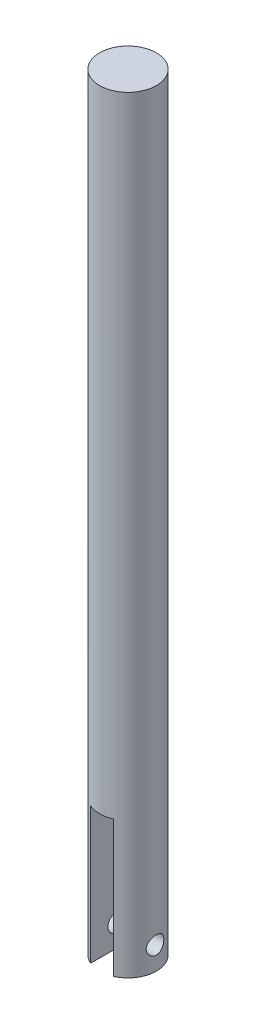
ISO-10303-21;
HEADER;
FILE_DESCRIPTION(('STEP AP214'),'2;1');
FILE_NAME('part.step','',(''),(''),'','','');
FILE_SCHEMA(('AUTOMOTIVE_DESIGN { 1 0 10303 214 1 1 1 1 }'));
ENDSEC;
DATA;
#1=APPLICATION_CONTEXT('core data for automotive mechanical design processes');
#2=APPLICATION_PROTOCOL_DEFINITION('international standard','automotive_design',2000,#1);
#3=PRODUCT_CONTEXT('',#1,'mechanical');
#4=PRODUCT('Part','Part','',(#3));
#5=PRODUCT_RELATED_PRODUCT_CATEGORY('part','',(#4));
#6=PRODUCT_DEFINITION_FORMATION('','',#4);
#7=PRODUCT_DEFINITION_CONTEXT('part definition',#1,'design');
#8=PRODUCT_DEFINITION('design','',#6,#7);
#9=PRODUCT_DEFINITION_SHAPE('','',#8);
#10=(LENGTH_UNIT() NAMED_UNIT(*) SI_UNIT(.MILLI.,.METRE.));
#11=(NAMED_UNIT(*) PLANE_ANGLE_UNIT() SI_UNIT($,.RADIAN.));
#12=(NAMED_UNIT(*) SI_UNIT($,.STERADIAN.) SOLID_ANGLE_UNIT());
#13=UNCERTAINTY_MEASURE_WITH_UNIT(LENGTH_MEASURE(1.E-05),#10,'distance_accuracy_value','');
#14=(GEOMETRIC_REPRESENTATION_CONTEXT(3) GLOBAL_UNCERTAINTY_ASSIGNED_CONTEXT((#13)) GLOBAL_UNIT_ASSIGNED_CONTEXT((#10,
#11,#12)) REPRESENTATION_CONTEXT('',''));
#15=CARTESIAN_POINT('',(0.,0.,0.));
#16=DIRECTION('',(0.,0.,1.));
#17=DIRECTION('',(1.,0.,0.));
#18=AXIS2_PLACEMENT_3D('',#15,#16,#17);
#19=CARTESIAN_POINT('',(0.,-67.5,0.));
#20=DIRECTION('',(0.,1.,0.));
#21=DIRECTION('',(0.,0.,1.));
#22=AXIS2_PLACEMENT_3D('',#19,#20,#21);
#23=PLANE('',#22);
#24=CARTESIAN_POINT('',(0.,-67.5,0.));
#25=DIRECTION('',(0.,1.,0.));
#26=DIRECTION('',(0.,0.,1.));
#27=AXIS2_PLACEMENT_3D('',#24,#25,#26);
#28=CIRCLE('',#27,5.);
#29=CARTESIAN_POINT('',(-2.,-67.5,-4.58257569495584));
#30=VERTEX_POINT('',#29);
#31=CARTESIAN_POINT('',(-2.,-67.5,4.58257569495584));
#32=VERTEX_POINT('',#31);
#33=EDGE_CURVE('E110',#30,#32,#28,.T.);
#34=ORIENTED_EDGE('',*,*,#33,.F.);
#35=DIRECTION('',(0.,0.,1.));
#36=VECTOR('',#35,1.);
#37=CARTESIAN_POINT('',(-2.,-67.5,0.));
#38=LINE('',#37,#36);
#39=EDGE_CURVE('E121',#30,#32,#38,.T.);
#40=ORIENTED_EDGE('',*,*,#39,.T.);
#41=EDGE_LOOP('',(#34,#40));
#42=FACE_BOUND('',#41,.T.);
#43=ADVANCED_FACE('F39',(#42),#23,.F.);
#44=CARTESIAN_POINT('',(0.,67.5,0.));
#45=DIRECTION('',(0.,-1.,0.));
#46=DIRECTION('',(0.,0.,-1.));
#47=AXIS2_PLACEMENT_3D('',#44,#45,#46);
#48=CYLINDRICAL_SURFACE('',#47,5.);
#49=CARTESIAN_POINT('',(-5.,-65.05,0.));
#50=CARTESIAN_POINT('',(-4.99999951036779,-65.0499993457353,-0.0848984604279461));
#51=CARTESIAN_POINT('',(-4.99781721187509,-65.0430017456515,-0.169803668342381));
#52=CARTESIAN_POINT('',(-4.98932527207252,-65.0152681888394,-0.337133220777893));
#53=CARTESIAN_POINT('',(-4.98301463670185,-64.9945289232447,-0.419556962786359));
#54=CARTESIAN_POINT('',(-4.96695583698883,-64.9400770879927,-0.579486364639223));
#55=CARTESIAN_POINT('',(-4.95721294513531,-64.9063844096165,-0.656999353904877));
#56=CARTESIAN_POINT('',(-4.93529695244566,-64.8270661701357,-0.805275561821527));
#57=CARTESIAN_POINT('',(-4.923123480586,-64.7814387868906,-0.876037747534824));
#58=CARTESIAN_POINT('',(-4.89722526714626,-64.678083745763,-1.01095832875081));
#59=CARTESIAN_POINT('',(-4.88346713124333,-64.6200584818204,-1.07488231229007));
#60=CARTESIAN_POINT('',(-4.85614480692875,-64.494188595476,-1.19226552074318));
#61=CARTESIAN_POINT('',(-4.84258065431989,-64.4263421854778,-1.24572283638974));
#62=CARTESIAN_POINT('',(-4.81682477265869,-64.2807359180547,-1.34191867293835));
#63=CARTESIAN_POINT('',(-4.8046743175935,-64.2027755047959,-1.38436572096407));
#64=CARTESIAN_POINT('',(-4.78362317675618,-64.0403853197357,-1.45544961933946));
#65=CARTESIAN_POINT('',(-4.77472165054594,-63.9559572278506,-1.48409004182491));
#66=CARTESIAN_POINT('',(-4.76152527274791,-63.7856708832014,-1.52589247703498));
#67=CARTESIAN_POINT('',(-4.75710149871766,-63.6999295101026,-1.53948878696478));
#68=CARTESIAN_POINT('',(-4.75297857101368,-63.5272773053626,-1.55217372132494));
#69=CARTESIAN_POINT('',(-4.75327818418307,-63.4403667848763,-1.55126613235546));
#70=CARTESIAN_POINT('',(-4.75845428577028,-63.2714234192705,-1.53530900350484));
#71=CARTESIAN_POINT('',(-4.76315261879822,-63.1893322083147,-1.5208099132708));
#72=CARTESIAN_POINT('',(-4.77630760142624,-63.0288102098725,-1.47897319925631));
#73=CARTESIAN_POINT('',(-4.78476464464349,-62.9503798067016,-1.45163423084961));
#74=CARTESIAN_POINT('',(-4.80462183036644,-62.7980873784583,-1.38450171199554));
#75=CARTESIAN_POINT('',(-4.81606267263906,-62.7243075855177,-1.34453416997656));
#76=CARTESIAN_POINT('',(-4.84057952939702,-62.5843205979564,-1.25339989003566));
#77=CARTESIAN_POINT('',(-4.85365596256883,-62.5181153506433,-1.2022302820293));
#78=CARTESIAN_POINT('',(-4.88068691421537,-62.3920427891873,-1.08743667269011));
#79=CARTESIAN_POINT('',(-4.89465453918908,-62.3325917382629,-1.0233577687063));
#80=CARTESIAN_POINT('',(-4.92137742235267,-62.2251790606602,-0.885965810322427));
#81=CARTESIAN_POINT('',(-4.9341325935214,-62.1772182582937,-0.812652093991197));
#82=CARTESIAN_POINT('',(-4.95712370655291,-62.0938714525739,-0.65807868545713));
#83=CARTESIAN_POINT('',(-4.96733986015102,-62.0585833239353,-0.576763076811218));
#84=CARTESIAN_POINT('',(-4.98395906682503,-62.0023096129635,-0.408959843162283));
#85=CARTESIAN_POINT('',(-4.99036325845885,-61.9813197597463,-0.322473770976239));
#86=CARTESIAN_POINT('',(-4.99845438764376,-61.9549442460457,-0.150319074279251));
#87=CARTESIAN_POINT('',(-5.00031163429244,-61.9489949385412,-0.0647446827565183));
#88=CARTESIAN_POINT('',(-4.99960248750333,-61.951282099157,0.106188109515848));
#89=CARTESIAN_POINT('',(-4.99703672887713,-61.9595165315567,0.191546539500474));
#90=CARTESIAN_POINT('',(-4.98788169118651,-61.9894842542252,0.357459797333216));
#91=CARTESIAN_POINT('',(-4.9813920802339,-62.010883381609,0.438081008945533));
#92=CARTESIAN_POINT('',(-4.96514689632701,-62.0661664630471,0.594567232233522));
#93=CARTESIAN_POINT('',(-4.95539092201505,-62.1000519514271,0.670431658053572));
#94=CARTESIAN_POINT('',(-4.93332471675189,-62.1802610005194,0.817286858698628));
#95=CARTESIAN_POINT('',(-4.92095852072226,-62.2268650207039,0.88811581324431));
#96=CARTESIAN_POINT('',(-4.89508710334594,-62.330850865784,1.02113752532934));
#97=CARTESIAN_POINT('',(-4.88158157830333,-62.3882355693777,1.08332796844852));
#98=CARTESIAN_POINT('',(-4.85429209347264,-62.5148044487681,1.19982105818673));
#99=CARTESIAN_POINT('',(-4.84051777932991,-62.5843611689143,1.25372210260317));
#100=CARTESIAN_POINT('',(-4.8148023151216,-62.7318317977621,1.34912131846231));
#101=CARTESIAN_POINT('',(-4.80286113172644,-62.809745554474,1.39061971542026));
#102=CARTESIAN_POINT('',(-4.78229760560468,-62.9715386379017,1.45977182503441));
#103=CARTESIAN_POINT('',(-4.77366186434556,-63.0553922124186,1.48748156983816));
#104=CARTESIAN_POINT('',(-4.76075522394671,-63.2268966862659,1.5282920920436));
#105=CARTESIAN_POINT('',(-4.75648269800308,-63.3145461575994,1.54139831446475));
#106=CARTESIAN_POINT('',(-4.75295389387882,-63.4869614568471,1.55224290370566));
#107=CARTESIAN_POINT('',(-4.75348283682888,-63.5716820215119,1.55063923708801));
#108=CARTESIAN_POINT('',(-4.75897670483196,-63.7395839927435,1.53369431627937));
#109=CARTESIAN_POINT('',(-4.76394142908372,-63.8227654688086,1.51835368394046));
#110=CARTESIAN_POINT('',(-4.77759858050365,-63.984072031623,1.47480761637236));
#111=CARTESIAN_POINT('',(-4.78623717549533,-64.0622520750943,1.44678760295161));
#112=CARTESIAN_POINT('',(-4.80625573394826,-64.2128636908133,1.37882379723991));
#113=CARTESIAN_POINT('',(-4.81763624850405,-64.285294103555,1.33887760753708));
#114=CARTESIAN_POINT('',(-4.84240420312915,-64.425375012139,1.24639244761276));
#115=CARTESIAN_POINT('',(-4.85585213290257,-64.4927332787408,1.19342709216221));
#116=CARTESIAN_POINT('',(-4.88295838962449,-64.6178188760105,1.07716085006953));
#117=CARTESIAN_POINT('',(-4.89661677162082,-64.6755436384804,1.01385721621446));
#118=CARTESIAN_POINT('',(-4.92312838994156,-64.7815680774942,0.876277521882482));
#119=CARTESIAN_POINT('',(-4.93594196348224,-64.8295077292466,0.801715529938181));
#120=CARTESIAN_POINT('',(-4.9588270762312,-64.9121075500023,0.64519347414163));
#121=CARTESIAN_POINT('',(-4.96889973502191,-64.9467731434281,0.563236449212159));
#122=CARTESIAN_POINT('',(-4.98442975017195,-64.9992026724845,0.401796551606231));
#123=CARTESIAN_POINT('',(-4.99021839691233,-65.0181974634066,0.32274401025635));
#124=CARTESIAN_POINT('',(-4.99800338668134,-65.0435952136464,0.162462753769385));
#125=CARTESIAN_POINT('',(-5.00000046850097,-65.0500006260283,0.0812344657079259));
#126=CARTESIAN_POINT('',(-5.,-65.05,0.));
#127=B_SPLINE_CURVE_WITH_KNOTS('',3,(#49,#50,#51,#52,#53,#54,#55,#56,#57,#58,#59,#60,#61,#62,
#63,#64,#65,#66,#67,#68,#69,#70,#71,#72,#73,#74,#75,#76,#77,#78,#79,#80,#81,#82,#83,#84,#85,#86,
#87,#88,#89,#90,#91,#92,#93,#94,#95,#96,#97,#98,#99,#100,#101,#102,#103,#104,#105,#106,#107,
#108,#109,#110,#111,#112,#113,#114,#115,#116,#117,#118,#119,#120,#121,#122,#123,#124,#125,#126),
.UNSPECIFIED.,.T.,.F.,(4,2,2,2,2,2,2,2,2,2,2,2,2,2,2,2,2,2,2,2,2,2,2,2,2,2,2,2,2,2,2,2,2,2,2,2,
2,2,4),(0.,0.254396830193011,0.508854939067413,0.762923852397204,1.01703157856677,
1.27811016261803,1.53923632679227,1.80669687701853,2.07408819100384,2.33354085793619,
2.59292578946425,2.8422397301572,3.09157978549387,3.34451706133851,3.59751921831482,
3.86184447125797,4.12618868125026,4.39253268700392,4.65879710108145,4.91492451484355,
5.17101517099384,5.42085927295126,5.67073408602786,5.92663973952149,6.18261382326728,
6.44855856503469,6.71449847087906,6.97934868222452,7.24410010934584,7.49706915491489,
7.75002674952946,7.99939903495255,8.24882148323299,8.5078669726871,8.76698141119867,
9.03437391807998,9.30165703853483,9.54512221360275,9.78853994431718),.UNSPECIFIED.);
#128=CARTESIAN_POINT('',(-5.,-65.05,0.));
#129=VERTEX_POINT('',#128);
#130=EDGE_CURVE('E91',#129,#129,#127,.T.);
#131=ORIENTED_EDGE('',*,*,#130,.T.);
#132=EDGE_LOOP('',(#131));
#133=FACE_BOUND('',#132,.T.);
#134=CARTESIAN_POINT('',(4.75368278285373,-63.5,-1.55));
#135=CARTESIAN_POINT('',(4.75368338318312,-63.5847877742578,-1.54999932445049));
#136=CARTESIAN_POINT('',(4.75597604415428,-63.6695823180615,-1.54301930684937));
#137=CARTESIAN_POINT('',(4.76485922806291,-63.8366827175628,-1.5153619179215));
#138=CARTESIAN_POINT('',(4.77145096734458,-63.9189878620329,-1.49468067006046));
#139=CARTESIAN_POINT('',(4.78811552792768,-64.0786651659922,-1.44039828115771));
#140=CARTESIAN_POINT('',(4.79818226186817,-64.1560456733739,-1.40681972161217));
#141=CARTESIAN_POINT('',(4.82065413172491,-64.3040959529124,-1.32777100324028));
#142=CARTESIAN_POINT('',(4.83305966808647,-64.3747645727521,-1.28229880749092));
#143=CARTESIAN_POINT('',(4.85928166228013,-64.5097737915088,-1.1791076392278));
#144=CARTESIAN_POINT('',(4.87312970759869,-64.5738541016014,-1.1210560673844));
#145=CARTESIAN_POINT('',(4.90040740401921,-64.6915438046881,-0.995065934420963));
#146=CARTESIAN_POINT('',(4.91383699745048,-64.7451517597084,-0.9271260177504));
#147=CARTESIAN_POINT('',(4.93912544740819,-64.8415198927725,-0.781421116058211));
#148=CARTESIAN_POINT('',(4.95094276970254,-64.8840125539279,-0.703471355961245));
#149=CARTESIAN_POINT('',(4.97130669962644,-64.9551835517835,-0.541103059477401));
#150=CARTESIAN_POINT('',(4.97985406299974,-64.9838650808708,-0.456686023209229));
#151=CARTESIAN_POINT('',(4.99249145310099,-65.0257321306354,-0.286504364449233));
#152=CARTESIAN_POINT('',(4.99670913702681,-65.0393624097787,-0.200858811151957));
#153=CARTESIAN_POINT('',(5.00066254882456,-65.0521486485471,-0.0283995101506737));
#154=CARTESIAN_POINT('',(5.00039927978316,-65.0513078476048,0.0584139717581482));
#155=CARTESIAN_POINT('',(4.99550961008036,-65.03546958186,0.227616592243764));
#156=CARTESIAN_POINT('',(4.99103177925663,-65.0209541528746,0.310055829415599));
#157=CARTESIAN_POINT('',(4.97839840788449,-64.9789688886777,0.471264684200549));
#158=CARTESIAN_POINT('',(4.97024262879787,-64.9514982132313,0.550034063434531));
#159=CARTESIAN_POINT('',(4.95096910673671,-64.8840691648426,0.702786234068731));
#160=CARTESIAN_POINT('',(4.93981665318097,-64.8439634351657,0.776699417946678));
#161=CARTESIAN_POINT('',(4.91572642569117,-64.7525206061698,0.916897530857914));
#162=CARTESIAN_POINT('',(4.90278820613097,-64.7011807015588,0.983180548237793));
#163=CARTESIAN_POINT('',(4.87587839757546,-64.586246919891,1.10911162178287));
#164=CARTESIAN_POINT('',(4.86188619075829,-64.5222365953204,1.16837571683096));
#165=CARTESIAN_POINT('',(4.83490489859096,-64.3850540035193,1.27544149640803));
#166=CARTESIAN_POINT('',(4.82191592762219,-64.3118806940798,1.32324187523421));
#167=CARTESIAN_POINT('',(4.79830885960788,-64.1573794555785,1.40646057010926));
#168=CARTESIAN_POINT('',(4.78771801016644,-64.0759716765852,1.44173894127851));
#169=CARTESIAN_POINT('',(4.77042665547974,-63.9079640086811,1.49796692355662));
#170=CARTESIAN_POINT('',(4.76372477897915,-63.8213659617607,1.51892158568244));
#171=CARTESIAN_POINT('',(4.75527386828027,-63.6491096853283,1.54517125873354));
#172=CARTESIAN_POINT('',(4.7533392642171,-63.5635499676143,1.55105336354816));
#173=CARTESIAN_POINT('',(4.75412714326178,-63.392660874709,1.54863734850404));
#174=CARTESIAN_POINT('',(4.75684892075536,-63.3073314665799,1.54034137714918));
#175=CARTESIAN_POINT('',(4.76645989425404,-63.1418366719239,1.51032901765577));
#176=CARTESIAN_POINT('',(4.77322892889427,-63.0615934796922,1.48899921153559));
#177=CARTESIAN_POINT('',(4.79004497620472,-62.9058331437314,1.43397739167441));
#178=CARTESIAN_POINT('',(4.8000925178125,-62.8303167649468,1.40028338304677));
#179=CARTESIAN_POINT('',(4.82268670620456,-62.6837880528322,1.3204005341875));
#180=CARTESIAN_POINT('',(4.83529605171656,-62.612963759932,1.27388496008762));
#181=CARTESIAN_POINT('',(4.86146229884052,-62.4799120928248,1.17006215242057));
#182=CARTESIAN_POINT('',(4.87501944213452,-62.4176869234655,1.11275215999177));
#183=CARTESIAN_POINT('',(4.9022212005975,-62.3009888664071,0.986193151690928));
#184=CARTESIAN_POINT('',(4.91584693311411,-62.2469343888246,0.916553254933861));
#185=CARTESIAN_POINT('',(4.94109851862769,-62.1512636130976,0.768862528489028));
#186=CARTESIAN_POINT('',(4.95272446501707,-62.1096467340352,0.690812091860641));
#187=CARTESIAN_POINT('',(4.97259909646356,-62.0404326015305,0.529004564982323));
#188=CARTESIAN_POINT('',(4.98087233569301,-62.0127330492662,0.445294404595903));
#189=CARTESIAN_POINT('',(4.99321749427584,-61.971895011554,0.274102614980312));
#190=CARTESIAN_POINT('',(4.99729070529247,-61.9587520493266,0.186622153884792));
#191=CARTESIAN_POINT('',(5.00069269120776,-61.947759266407,0.014227576932652));
#192=CARTESIAN_POINT('',(5.00020911771839,-61.9493045950117,-0.0706447286565983));
#193=CARTESIAN_POINT('',(4.99499988378582,-61.9661852358345,-0.238866202506539));
#194=CARTESIAN_POINT('',(4.99027449245274,-61.9815196732418,-0.322215467049978));
#195=CARTESIAN_POINT('',(4.9771707692371,-62.0251602272106,-0.484032482158854));
#196=CARTESIAN_POINT('',(4.96883747266182,-62.0533066352906,-0.562547204392897));
#197=CARTESIAN_POINT('',(4.94937774626471,-62.1216282102899,-0.713778331813043));
#198=CARTESIAN_POINT('',(4.93825084118151,-62.1618054241688,-0.786493747618413));
#199=CARTESIAN_POINT('',(4.91390226151419,-62.254607405761,-0.926715240954741));
#200=CARTESIAN_POINT('',(4.90062284621096,-62.3076044617166,-0.993964803715884));
#201=CARTESIAN_POINT('',(4.87363682565115,-62.423882340195,-1.11881721813864));
#202=CARTESIAN_POINT('',(4.85993009453773,-62.4871662160577,-1.17641719526518));
#203=CARTESIAN_POINT('',(4.833114225863,-62.6246832801582,-1.28221966909729));
#204=CARTESIAN_POINT('',(4.82003891121211,-62.6992051252777,-1.33005658427393));
#205=CARTESIAN_POINT('',(4.79653672197388,-62.8556212146437,-1.41247383450481));
#206=CARTESIAN_POINT('',(4.78610873511453,-62.9375123430402,-1.44705974007727));
#207=CARTESIAN_POINT('',(4.76997256833105,-63.0987725617558,-1.4993476306208));
#208=CARTESIAN_POINT('',(4.76392456098058,-63.1777074132407,-1.51828719118412));
#209=CARTESIAN_POINT('',(4.75577984823929,-63.3377597913078,-1.54361221468726));
#210=CARTESIAN_POINT('',(4.75368220847089,-63.4188767971413,-1.55000064635191));
#211=CARTESIAN_POINT('',(4.75368278285373,-63.5,-1.55));
#212=B_SPLINE_CURVE_WITH_KNOTS('',3,(#134,#135,#136,#137,#138,#139,#140,#141,#142,#143,#144,
#145,#146,#147,#148,#149,#150,#151,#152,#153,#154,#155,#156,#157,#158,#159,#160,#161,#162,#163,
#164,#165,#166,#167,#168,#169,#170,#171,#172,#173,#174,#175,#176,#177,#178,#179,#180,#181,#182,
#183,#184,#185,#186,#187,#188,#189,#190,#191,#192,#193,#194,#195,#196,#197,#198,#199,#200,#201,
#202,#203,#204,#205,#206,#207,#208,#209,#210,#211),.UNSPECIFIED.,.T.,.F.,(4,2,2,2,2,2,2,2,2,2,2,
2,2,2,2,2,2,2,2,2,2,2,2,2,2,2,2,2,2,2,2,2,2,2,2,2,2,2,4),(0.,0.254063742253652,0.50819939831674,
0.761892109785909,1.0156282975521,1.2771402448314,1.53868807547997,1.80604772654606,
2.07334554881432,2.33251389937151,2.5916242343911,2.84192960726694,3.09225121636408,
3.3456075942636,3.59902731027013,3.8628478549896,4.12669843427996,4.39341124807615,
4.66002996146249,4.91609377382728,5.17211878647721,5.42089570959394,5.66971278896991,
5.92557410205819,6.1815008977088,6.44784025735558,6.71416717525435,6.97850672862433,
7.24276496358546,7.49619000104125,7.74959896179961,7.99993206355677,8.25030778201047,
8.50908094556253,8.76793105904189,9.03518047186343,9.30231741359697,9.54545790674849,
9.78854088282966),.UNSPECIFIED.);
#213=CARTESIAN_POINT('',(4.75368278285373,-63.5,-1.55));
#214=VERTEX_POINT('',#213);
#215=EDGE_CURVE('E162',#214,#214,#212,.T.);
#216=ORIENTED_EDGE('',*,*,#215,.T.);
#217=EDGE_LOOP('',(#216));
#218=FACE_BOUND('',#217,.T.);
#219=CARTESIAN_POINT('',(0.,67.5,0.));
#220=DIRECTION('',(0.,1.,0.));
#221=DIRECTION('',(0.,0.,1.));
#222=AXIS2_PLACEMENT_3D('',#219,#220,#221);
#223=CIRCLE('',#222,5.);
#224=CARTESIAN_POINT('',(0.,67.5,5.));
#225=VERTEX_POINT('',#224);
#226=EDGE_CURVE('E111',#225,#225,#223,.T.);
#227=ORIENTED_EDGE('',*,*,#226,.F.);
#228=EDGE_LOOP('',(#227));
#229=FACE_BOUND('',#228,.T.);
#230=CARTESIAN_POINT('',(0.,-43.5,0.));
#231=DIRECTION('',(0.,1.,0.));
#232=DIRECTION('',(0.,0.,1.));
#233=AXIS2_PLACEMENT_3D('',#230,#231,#232);
#234=CIRCLE('',#233,5.);
#235=CARTESIAN_POINT('',(-2.,-43.5,4.58257569495584));
#236=VERTEX_POINT('',#235);
#237=CARTESIAN_POINT('',(2.,-43.5,4.58257569495584));
#238=VERTEX_POINT('',#237);
#239=EDGE_CURVE('E50',#236,#238,#234,.T.);
#240=ORIENTED_EDGE('',*,*,#239,.T.);
#241=DIRECTION('',(0.,-1.,0.));
#242=VECTOR('',#241,1.);
#243=CARTESIAN_POINT('',(2.,67.5,4.58257569495584));
#244=LINE('',#243,#242);
#245=CARTESIAN_POINT('',(2.,-67.5,4.58257569495584));
#246=VERTEX_POINT('',#245);
#247=EDGE_CURVE('E89',#238,#246,#244,.T.);
#248=ORIENTED_EDGE('',*,*,#247,.T.);
#249=CARTESIAN_POINT('',(2.,-67.5,-4.58257569495584));
#250=VERTEX_POINT('',#249);
#251=EDGE_CURVE('E95',#246,#250,#28,.T.);
#252=ORIENTED_EDGE('',*,*,#251,.T.);
#253=DIRECTION('',(0.,-1.,0.));
#254=VECTOR('',#253,1.);
#255=CARTESIAN_POINT('',(2.,67.5,-4.58257569495584));
#256=LINE('',#255,#254);
#257=CARTESIAN_POINT('',(2.,-43.5,-4.58257569495584));
#258=VERTEX_POINT('',#257);
#259=EDGE_CURVE('E57',#250,#258,#256,.F.);
#260=ORIENTED_EDGE('',*,*,#259,.T.);
#261=CARTESIAN_POINT('',(-2.,-43.5,-4.58257569495584));
#262=VERTEX_POINT('',#261);
#263=EDGE_CURVE('E11',#258,#262,#234,.T.);
#264=ORIENTED_EDGE('',*,*,#263,.T.);
#265=DIRECTION('',(0.,-1.,0.));
#266=VECTOR('',#265,1.);
#267=CARTESIAN_POINT('',(-2.,67.5,-4.58257569495584));
#268=LINE('',#267,#266);
#269=EDGE_CURVE('E107',#262,#30,#268,.T.);
#270=ORIENTED_EDGE('',*,*,#269,.T.);
#271=ORIENTED_EDGE('',*,*,#33,.T.);
#272=DIRECTION('',(0.,-1.,0.));
#273=VECTOR('',#272,1.);
#274=CARTESIAN_POINT('',(-2.,67.5,4.58257569495584));
#275=LINE('',#274,#273);
#276=EDGE_CURVE('E100',#32,#236,#275,.F.);
#277=ORIENTED_EDGE('',*,*,#276,.T.);
#278=EDGE_LOOP('',(#240,#248,#252,#260,#264,#270,#271,#277));
#279=FACE_BOUND('',#278,.T.);
#280=ADVANCED_FACE('F41',(#133,#218,#229,#279),#48,.T.);
#281=CARTESIAN_POINT('',(0.,67.5,0.));
#282=DIRECTION('',(0.,1.,0.));
#283=DIRECTION('',(0.,0.,1.));
#284=AXIS2_PLACEMENT_3D('',#281,#282,#283);
#285=PLANE('',#284);
#286=ORIENTED_EDGE('',*,*,#226,.T.);
#287=EDGE_LOOP('',(#286));
#288=FACE_BOUND('',#287,.T.);
#289=ADVANCED_FACE('F134',(#288),#285,.T.);
#290=ORIENTED_EDGE('',*,*,#251,.F.);
#291=DIRECTION('',(0.,0.,-1.));
#292=VECTOR('',#291,1.);
#293=CARTESIAN_POINT('',(2.,-67.5,0.));
#294=LINE('',#293,#292);
#295=EDGE_CURVE('E115',#246,#250,#294,.T.);
#296=ORIENTED_EDGE('',*,*,#295,.T.);
#297=EDGE_LOOP('',(#290,#296));
#298=FACE_BOUND('',#297,.T.);
#299=ADVANCED_FACE('F130',(#298),#23,.F.);
#300=CARTESIAN_POINT('',(-2.,-43.5,-5.));
#301=DIRECTION('',(0.,1.,0.));
#302=DIRECTION('',(0.,0.,1.));
#303=AXIS2_PLACEMENT_3D('',#300,#301,#302);
#304=PLANE('',#303);
#305=DIRECTION('',(0.,0.,1.));
#306=VECTOR('',#305,1.);
#307=CARTESIAN_POINT('',(2.,-43.5,-5.));
#308=LINE('',#307,#306);
#309=EDGE_CURVE('E82',#258,#238,#308,.T.);
#310=ORIENTED_EDGE('',*,*,#309,.T.);
#311=ORIENTED_EDGE('',*,*,#239,.F.);
#312=DIRECTION('',(0.,0.,1.));
#313=VECTOR('',#312,1.);
#314=CARTESIAN_POINT('',(-2.,-43.5,-5.));
#315=LINE('',#314,#313);
#316=EDGE_CURVE('E83',#262,#236,#315,.T.);
#317=ORIENTED_EDGE('',*,*,#316,.F.);
#318=ORIENTED_EDGE('',*,*,#263,.F.);
#319=EDGE_LOOP('',(#310,#311,#317,#318));
#320=FACE_BOUND('',#319,.T.);
#321=ADVANCED_FACE('F81',(#320),#304,.F.);
#322=CARTESIAN_POINT('',(-2.,-67.5,-5.));
#323=DIRECTION('',(-1.,0.,0.));
#324=DIRECTION('',(0.,0.,1.));
#325=AXIS2_PLACEMENT_3D('',#322,#323,#324);
#326=PLANE('',#325);
#327=CARTESIAN_POINT('',(-2.,-63.5,0.));
#328=DIRECTION('',(-1.,0.,0.));
#329=DIRECTION('',(0.,0.,1.));
#330=AXIS2_PLACEMENT_3D('',#327,#328,#329);
#331=CIRCLE('',#330,1.55);
#332=CARTESIAN_POINT('',(-2.,-63.5,1.55));
#333=VERTEX_POINT('',#332);
#334=EDGE_CURVE('E176',#333,#333,#331,.T.);
#335=ORIENTED_EDGE('',*,*,#334,.T.);
#336=EDGE_LOOP('',(#335));
#337=FACE_BOUND('',#336,.T.);
#338=ORIENTED_EDGE('',*,*,#316,.T.);
#339=ORIENTED_EDGE('',*,*,#276,.F.);
#340=ORIENTED_EDGE('',*,*,#39,.F.);
#341=ORIENTED_EDGE('',*,*,#269,.F.);
#342=EDGE_LOOP('',(#338,#339,#340,#341));
#343=FACE_BOUND('',#342,.T.);
#344=ADVANCED_FACE('F127',(#337,#343),#326,.F.);
#345=CARTESIAN_POINT('',(2.,-67.5,-5.));
#346=DIRECTION('',(1.,0.,0.));
#347=DIRECTION('',(0.,0.,-1.));
#348=AXIS2_PLACEMENT_3D('',#345,#346,#347);
#349=PLANE('',#348);
#350=CARTESIAN_POINT('',(2.,-63.5,0.));
#351=DIRECTION('',(1.,0.,0.));
#352=DIRECTION('',(0.,0.,-1.));
#353=AXIS2_PLACEMENT_3D('',#350,#351,#352);
#354=CIRCLE('',#353,1.55);
#355=CARTESIAN_POINT('',(2.,-63.5,-1.55));
#356=VERTEX_POINT('',#355);
#357=EDGE_CURVE('E44',#356,#356,#354,.T.);
#358=ORIENTED_EDGE('',*,*,#357,.T.);
#359=EDGE_LOOP('',(#358));
#360=FACE_BOUND('',#359,.T.);
#361=ORIENTED_EDGE('',*,*,#309,.F.);
#362=ORIENTED_EDGE('',*,*,#259,.F.);
#363=ORIENTED_EDGE('',*,*,#295,.F.);
#364=ORIENTED_EDGE('',*,*,#247,.F.);
#365=EDGE_LOOP('',(#361,#362,#363,#364));
#366=FACE_BOUND('',#365,.T.);
#367=ADVANCED_FACE('F87',(#360,#366),#349,.F.);
#368=CARTESIAN_POINT('',(-5.,-63.5,0.));
#369=DIRECTION('',(1.,0.,0.));
#370=DIRECTION('',(0.,0.,-1.));
#371=AXIS2_PLACEMENT_3D('',#368,#369,#370);
#372=CYLINDRICAL_SURFACE('',#371,1.55);
#373=ORIENTED_EDGE('',*,*,#357,.F.);
#374=EDGE_LOOP('',(#373));
#375=FACE_BOUND('',#374,.T.);
#376=ORIENTED_EDGE('',*,*,#215,.F.);
#377=EDGE_LOOP('',(#376));
#378=FACE_BOUND('',#377,.T.);
#379=ADVANCED_FACE('F153',(#375,#378),#372,.F.);
#380=ORIENTED_EDGE('',*,*,#334,.F.);
#381=EDGE_LOOP('',(#380));
#382=FACE_BOUND('',#381,.T.);
#383=ORIENTED_EDGE('',*,*,#130,.F.);
#384=EDGE_LOOP('',(#383));
#385=FACE_BOUND('',#384,.T.);
#386=ADVANCED_FACE('F156',(#382,#385),#372,.F.);
#387=CLOSED_SHELL('',(#43,#280,#289,#299,#321,#344,#367,#379,#386));
#388=MANIFOLD_SOLID_BREP('B2',#387);
#389=ADVANCED_BREP_SHAPE_REPRESENTATION('',(#18,#388),#14);
#390=SHAPE_DEFINITION_REPRESENTATION(#9,#389);
ENDSEC;
END-ISO-10303-21;
